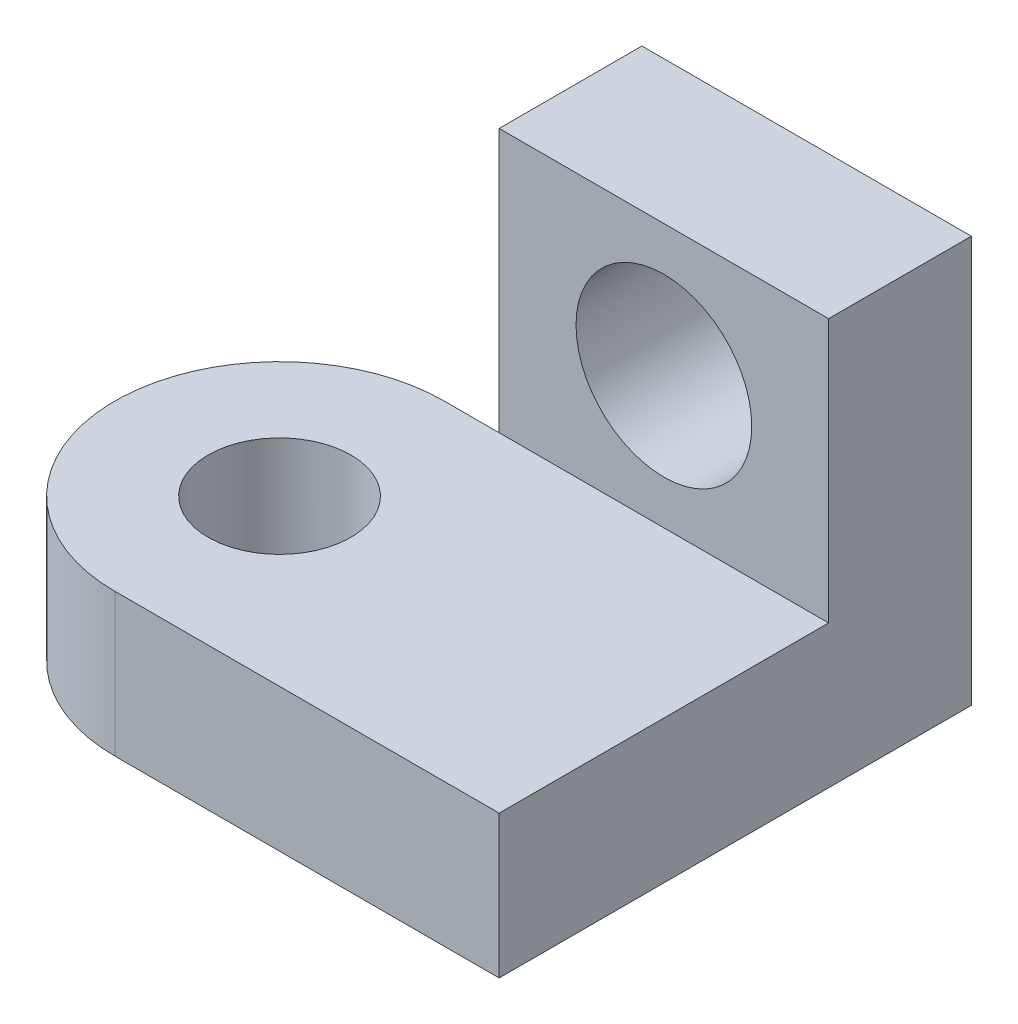
ISO-10303-21;
HEADER;
FILE_DESCRIPTION(('STEP AP214'),'2;1');
FILE_NAME('part.step','',(''),(''),'','','');
FILE_SCHEMA(('AUTOMOTIVE_DESIGN { 1 0 10303 214 1 1 1 1 }'));
ENDSEC;
DATA;
#1=APPLICATION_CONTEXT('core data for automotive mechanical design processes');
#2=APPLICATION_PROTOCOL_DEFINITION('international standard','automotive_design',2000,#1);
#3=PRODUCT_CONTEXT('',#1,'mechanical');
#4=PRODUCT('Part','Part','',(#3));
#5=PRODUCT_RELATED_PRODUCT_CATEGORY('part','',(#4));
#6=PRODUCT_DEFINITION_FORMATION('','',#4);
#7=PRODUCT_DEFINITION_CONTEXT('part definition',#1,'design');
#8=PRODUCT_DEFINITION('design','',#6,#7);
#9=PRODUCT_DEFINITION_SHAPE('','',#8);
#10=(LENGTH_UNIT() NAMED_UNIT(*) SI_UNIT(.MILLI.,.METRE.));
#11=(NAMED_UNIT(*) PLANE_ANGLE_UNIT() SI_UNIT($,.RADIAN.));
#12=(NAMED_UNIT(*) SI_UNIT($,.STERADIAN.) SOLID_ANGLE_UNIT());
#13=UNCERTAINTY_MEASURE_WITH_UNIT(LENGTH_MEASURE(1.E-05),#10,'distance_accuracy_value','');
#14=(GEOMETRIC_REPRESENTATION_CONTEXT(3) GLOBAL_UNCERTAINTY_ASSIGNED_CONTEXT((#13)) GLOBAL_UNIT_ASSIGNED_CONTEXT((#10,
#11,#12)) REPRESENTATION_CONTEXT('',''));
#15=CARTESIAN_POINT('',(0.,0.,0.));
#16=DIRECTION('',(0.,0.,1.));
#17=DIRECTION('',(1.,0.,0.));
#18=AXIS2_PLACEMENT_3D('',#15,#16,#17);
#19=CARTESIAN_POINT('',(0.,13.,43.));
#20=DIRECTION('',(0.,-1.,0.));
#21=DIRECTION('',(1.,0.,0.));
#22=AXIS2_PLACEMENT_3D('',#19,#20,#21);
#23=PLANE('',#22);
#24=CARTESIAN_POINT('',(-35.,13.,28.));
#25=DIRECTION('',(0.,1.,0.));
#26=DIRECTION('',(-1.,0.,0.));
#27=AXIS2_PLACEMENT_3D('',#24,#25,#26);
#28=CIRCLE('',#27,6.5);
#29=CARTESIAN_POINT('',(-41.5,13.,28.));
#30=VERTEX_POINT('',#29);
#31=EDGE_CURVE('E171',#30,#30,#28,.T.);
#32=ORIENTED_EDGE('',*,*,#31,.F.);
#33=EDGE_LOOP('',(#32));
#34=FACE_BOUND('',#33,.T.);
#35=CARTESIAN_POINT('',(-35.,13.,28.));
#36=DIRECTION('',(0.,1.,0.));
#37=DIRECTION('',(-1.,0.,0.));
#38=AXIS2_PLACEMENT_3D('',#35,#36,#37);
#39=CIRCLE('',#38,15.);
#40=CARTESIAN_POINT('',(-35.,13.,13.));
#41=VERTEX_POINT('',#40);
#42=CARTESIAN_POINT('',(-35.,13.,43.));
#43=VERTEX_POINT('',#42);
#44=EDGE_CURVE('E50',#41,#43,#39,.T.);
#45=ORIENTED_EDGE('',*,*,#44,.T.);
#46=DIRECTION('',(-1.,0.,0.));
#47=VECTOR('',#46,1.);
#48=CARTESIAN_POINT('',(0.,13.,43.));
#49=LINE('',#48,#47);
#50=CARTESIAN_POINT('',(0.,13.,43.));
#51=VERTEX_POINT('',#50);
#52=EDGE_CURVE('E100',#51,#43,#49,.T.);
#53=ORIENTED_EDGE('',*,*,#52,.F.);
#54=DIRECTION('',(0.,0.,-1.));
#55=VECTOR('',#54,1.);
#56=CARTESIAN_POINT('',(0.,13.,43.));
#57=LINE('',#56,#55);
#58=CARTESIAN_POINT('',(0.,13.,13.));
#59=VERTEX_POINT('',#58);
#60=EDGE_CURVE('E124',#51,#59,#57,.T.);
#61=ORIENTED_EDGE('',*,*,#60,.T.);
#62=DIRECTION('',(1.,0.,0.));
#63=VECTOR('',#62,1.);
#64=CARTESIAN_POINT('',(0.,13.,13.));
#65=LINE('',#64,#63);
#66=CARTESIAN_POINT('',(-30.,13.,13.));
#67=VERTEX_POINT('',#66);
#68=EDGE_CURVE('E134',#67,#59,#65,.T.);
#69=ORIENTED_EDGE('',*,*,#68,.F.);
#70=DIRECTION('',(1.,0.,0.));
#71=VECTOR('',#70,1.);
#72=CARTESIAN_POINT('',(-50.,13.,13.));
#73=LINE('',#72,#71);
#74=EDGE_CURVE('E103',#41,#67,#73,.T.);
#75=ORIENTED_EDGE('',*,*,#74,.F.);
#76=EDGE_LOOP('',(#45,#53,#61,#69,#75));
#77=FACE_BOUND('',#76,.T.);
#78=ADVANCED_FACE('F35',(#34,#77),#23,.F.);
#79=CARTESIAN_POINT('',(0.,0.,43.));
#80=DIRECTION('',(0.,-1.,0.));
#81=DIRECTION('',(1.,0.,0.));
#82=AXIS2_PLACEMENT_3D('',#79,#80,#81);
#83=PLANE('',#82);
#84=CARTESIAN_POINT('',(-35.,0.,28.));
#85=DIRECTION('',(0.,-1.,0.));
#86=DIRECTION('',(1.,0.,0.));
#87=AXIS2_PLACEMENT_3D('',#84,#85,#86);
#88=CIRCLE('',#87,6.5);
#89=CARTESIAN_POINT('',(-28.5,0.,28.));
#90=VERTEX_POINT('',#89);
#91=EDGE_CURVE('E39',#90,#90,#88,.T.);
#92=ORIENTED_EDGE('',*,*,#91,.F.);
#93=EDGE_LOOP('',(#92));
#94=FACE_BOUND('',#93,.T.);
#95=DIRECTION('',(-1.,0.,0.));
#96=VECTOR('',#95,1.);
#97=CARTESIAN_POINT('',(0.,0.,43.));
#98=LINE('',#97,#96);
#99=CARTESIAN_POINT('',(0.,0.,43.));
#100=VERTEX_POINT('',#99);
#101=CARTESIAN_POINT('',(-35.,0.,43.));
#102=VERTEX_POINT('',#101);
#103=EDGE_CURVE('E115',#100,#102,#98,.T.);
#104=ORIENTED_EDGE('',*,*,#103,.T.);
#105=CARTESIAN_POINT('',(-35.,0.,28.));
#106=DIRECTION('',(0.,-1.,0.));
#107=DIRECTION('',(1.,0.,0.));
#108=AXIS2_PLACEMENT_3D('',#105,#106,#107);
#109=CIRCLE('',#108,15.);
#110=CARTESIAN_POINT('',(-35.,0.,13.));
#111=VERTEX_POINT('',#110);
#112=EDGE_CURVE('E104',#102,#111,#109,.T.);
#113=ORIENTED_EDGE('',*,*,#112,.T.);
#114=DIRECTION('',(-1.,0.,0.));
#115=VECTOR('',#114,1.);
#116=CARTESIAN_POINT('',(0.,0.,13.));
#117=LINE('',#116,#115);
#118=CARTESIAN_POINT('',(-30.,0.,13.));
#119=VERTEX_POINT('',#118);
#120=EDGE_CURVE('E160',#119,#111,#117,.T.);
#121=ORIENTED_EDGE('',*,*,#120,.F.);
#122=DIRECTION('',(0.,0.,1.));
#123=VECTOR('',#122,1.);
#124=CARTESIAN_POINT('',(-30.,0.,43.));
#125=LINE('',#124,#123);
#126=CARTESIAN_POINT('',(-30.,0.,0.));
#127=VERTEX_POINT('',#126);
#128=EDGE_CURVE('E162',#127,#119,#125,.T.);
#129=ORIENTED_EDGE('',*,*,#128,.F.);
#130=DIRECTION('',(-1.,0.,0.));
#131=VECTOR('',#130,1.);
#132=CARTESIAN_POINT('',(0.,0.,0.));
#133=LINE('',#132,#131);
#134=CARTESIAN_POINT('',(0.,0.,0.));
#135=VERTEX_POINT('',#134);
#136=EDGE_CURVE('E116',#135,#127,#133,.T.);
#137=ORIENTED_EDGE('',*,*,#136,.F.);
#138=DIRECTION('',(0.,0.,-1.));
#139=VECTOR('',#138,1.);
#140=CARTESIAN_POINT('',(0.,0.,43.));
#141=LINE('',#140,#139);
#142=EDGE_CURVE('E127',#100,#135,#141,.T.);
#143=ORIENTED_EDGE('',*,*,#142,.F.);
#144=EDGE_LOOP('',(#104,#113,#121,#129,#137,#143));
#145=FACE_BOUND('',#144,.T.);
#146=ADVANCED_FACE('F167',(#94,#145),#83,.T.);
#147=CARTESIAN_POINT('',(0.,0.,13.));
#148=DIRECTION('',(-1.,0.,0.));
#149=DIRECTION('',(0.,-1.,0.));
#150=AXIS2_PLACEMENT_3D('',#147,#148,#149);
#151=PLANE('',#150);
#152=DIRECTION('',(0.,1.,0.));
#153=VECTOR('',#152,1.);
#154=CARTESIAN_POINT('',(0.,0.,0.));
#155=LINE('',#154,#153);
#156=CARTESIAN_POINT('',(0.,37.,0.));
#157=VERTEX_POINT('',#156);
#158=EDGE_CURVE('E149',#135,#157,#155,.T.);
#159=ORIENTED_EDGE('',*,*,#158,.T.);
#160=DIRECTION('',(0.,0.,-1.));
#161=VECTOR('',#160,1.);
#162=CARTESIAN_POINT('',(0.,37.,13.));
#163=LINE('',#162,#161);
#164=CARTESIAN_POINT('',(0.,37.,13.));
#165=VERTEX_POINT('',#164);
#166=EDGE_CURVE('E158',#165,#157,#163,.T.);
#167=ORIENTED_EDGE('',*,*,#166,.F.);
#168=DIRECTION('',(0.,1.,0.));
#169=VECTOR('',#168,1.);
#170=CARTESIAN_POINT('',(0.,0.,13.));
#171=LINE('',#170,#169);
#172=EDGE_CURVE('E138',#59,#165,#171,.T.);
#173=ORIENTED_EDGE('',*,*,#172,.F.);
#174=ORIENTED_EDGE('',*,*,#60,.F.);
#175=DIRECTION('',(0.,-1.,0.));
#176=VECTOR('',#175,1.);
#177=CARTESIAN_POINT('',(0.,0.,43.));
#178=LINE('',#177,#176);
#179=EDGE_CURVE('E114',#51,#100,#178,.T.);
#180=ORIENTED_EDGE('',*,*,#179,.T.);
#181=ORIENTED_EDGE('',*,*,#142,.T.);
#182=EDGE_LOOP('',(#159,#167,#173,#174,#180,#181));
#183=FACE_BOUND('',#182,.T.);
#184=ADVANCED_FACE('F181',(#183),#151,.F.);
#185=CARTESIAN_POINT('',(0.,37.,13.));
#186=DIRECTION('',(0.,1.,0.));
#187=DIRECTION('',(0.,0.,1.));
#188=AXIS2_PLACEMENT_3D('',#185,#186,#187);
#189=PLANE('',#188);
#190=DIRECTION('',(1.,0.,0.));
#191=VECTOR('',#190,1.);
#192=CARTESIAN_POINT('',(0.,37.,0.));
#193=LINE('',#192,#191);
#194=CARTESIAN_POINT('',(-30.,37.,0.));
#195=VERTEX_POINT('',#194);
#196=EDGE_CURVE('E152',#195,#157,#193,.T.);
#197=ORIENTED_EDGE('',*,*,#196,.F.);
#198=DIRECTION('',(0.,0.,-1.));
#199=VECTOR('',#198,1.);
#200=CARTESIAN_POINT('',(-30.,37.,13.));
#201=LINE('',#200,#199);
#202=CARTESIAN_POINT('',(-30.,37.,13.));
#203=VERTEX_POINT('',#202);
#204=EDGE_CURVE('E146',#203,#195,#201,.T.);
#205=ORIENTED_EDGE('',*,*,#204,.F.);
#206=DIRECTION('',(1.,0.,0.));
#207=VECTOR('',#206,1.);
#208=CARTESIAN_POINT('',(0.,37.,13.));
#209=LINE('',#208,#207);
#210=EDGE_CURVE('E140',#203,#165,#209,.T.);
#211=ORIENTED_EDGE('',*,*,#210,.T.);
#212=ORIENTED_EDGE('',*,*,#166,.T.);
#213=EDGE_LOOP('',(#197,#205,#211,#212));
#214=FACE_BOUND('',#213,.T.);
#215=ADVANCED_FACE('F187',(#214),#189,.T.);
#216=CARTESIAN_POINT('',(-15.,25.,13.));
#217=DIRECTION('',(0.,0.,-1.));
#218=DIRECTION('',(-1.,0.,0.));
#219=AXIS2_PLACEMENT_3D('',#216,#217,#218);
#220=CYLINDRICAL_SURFACE('',#219,8.);
#221=CARTESIAN_POINT('',(-15.,25.,13.));
#222=DIRECTION('',(0.,0.,1.));
#223=DIRECTION('',(1.,0.,0.));
#224=AXIS2_PLACEMENT_3D('',#221,#222,#223);
#225=CIRCLE('',#224,8.);
#226=CARTESIAN_POINT('',(-23.,25.,13.));
#227=VERTEX_POINT('',#226);
#228=EDGE_CURVE('E131',#227,#227,#225,.T.);
#229=CARTESIAN_POINT('',(-15.,25.,0.));
#230=DIRECTION('',(0.,0.,1.));
#231=DIRECTION('',(1.,0.,0.));
#232=AXIS2_PLACEMENT_3D('',#229,#230,#231);
#233=CIRCLE('',#232,8.);
#234=CARTESIAN_POINT('',(-23.,25.,0.));
#235=VERTEX_POINT('',#234);
#236=EDGE_CURVE('E130',#235,#235,#233,.T.);
#237=CARTESIAN_POINT('',(-23.,25.,13.));
#238=CARTESIAN_POINT('',(-23.,25.,12.8645833333333));
#239=CARTESIAN_POINT('',(-23.,25.,12.7291666666667));
#240=CARTESIAN_POINT('',(-23.,25.,12.4583333333333));
#241=CARTESIAN_POINT('',(-23.,25.,12.3229166666667));
#242=CARTESIAN_POINT('',(-23.,25.,12.0520833333333));
#243=CARTESIAN_POINT('',(-23.,25.,11.9166666666667));
#244=CARTESIAN_POINT('',(-23.,25.,11.6458333333333));
#245=CARTESIAN_POINT('',(-23.,25.,11.5104166666667));
#246=CARTESIAN_POINT('',(-23.,25.,11.2395833333333));
#247=CARTESIAN_POINT('',(-23.,25.,11.1041666666667));
#248=CARTESIAN_POINT('',(-23.,25.,10.8333333333333));
#249=CARTESIAN_POINT('',(-23.,25.,10.6979166666667));
#250=CARTESIAN_POINT('',(-23.,25.,10.4270833333333));
#251=CARTESIAN_POINT('',(-23.,25.,10.2916666666667));
#252=CARTESIAN_POINT('',(-23.,25.,10.0208333333333));
#253=CARTESIAN_POINT('',(-23.,25.,9.88541666666667));
#254=CARTESIAN_POINT('',(-23.,25.,9.61458333333333));
#255=CARTESIAN_POINT('',(-23.,25.,9.47916666666667));
#256=CARTESIAN_POINT('',(-23.,25.,9.20833333333333));
#257=CARTESIAN_POINT('',(-23.,25.,9.07291666666666));
#258=CARTESIAN_POINT('',(-23.,25.,8.80208333333333));
#259=CARTESIAN_POINT('',(-23.,25.,8.66666666666667));
#260=CARTESIAN_POINT('',(-23.,25.,8.39583333333333));
#261=CARTESIAN_POINT('',(-23.,25.,8.26041666666667));
#262=CARTESIAN_POINT('',(-23.,25.,7.98958333333333));
#263=CARTESIAN_POINT('',(-23.,25.,7.85416666666667));
#264=CARTESIAN_POINT('',(-23.,25.,7.58333333333333));
#265=CARTESIAN_POINT('',(-23.,25.,7.44791666666667));
#266=CARTESIAN_POINT('',(-23.,25.,7.17708333333333));
#267=CARTESIAN_POINT('',(-23.,25.,7.04166666666667));
#268=CARTESIAN_POINT('',(-23.,25.,6.77083333333333));
#269=CARTESIAN_POINT('',(-23.,25.,6.63541666666667));
#270=CARTESIAN_POINT('',(-23.,25.,6.36458333333333));
#271=CARTESIAN_POINT('',(-23.,25.,6.22916666666667));
#272=CARTESIAN_POINT('',(-23.,25.,5.95833333333333));
#273=CARTESIAN_POINT('',(-23.,25.,5.82291666666667));
#274=CARTESIAN_POINT('',(-23.,25.,5.55208333333333));
#275=CARTESIAN_POINT('',(-23.,25.,5.41666666666667));
#276=CARTESIAN_POINT('',(-23.,25.,5.14583333333333));
#277=CARTESIAN_POINT('',(-23.,25.,5.01041666666667));
#278=CARTESIAN_POINT('',(-23.,25.,4.73958333333333));
#279=CARTESIAN_POINT('',(-23.,25.,4.60416666666667));
#280=CARTESIAN_POINT('',(-23.,25.,4.33333333333333));
#281=CARTESIAN_POINT('',(-23.,25.,4.19791666666667));
#282=CARTESIAN_POINT('',(-23.,25.,3.92708333333333));
#283=CARTESIAN_POINT('',(-23.,25.,3.79166666666667));
#284=CARTESIAN_POINT('',(-23.,25.,3.52083333333333));
#285=CARTESIAN_POINT('',(-23.,25.,3.38541666666667));
#286=CARTESIAN_POINT('',(-23.,25.,3.11458333333333));
#287=CARTESIAN_POINT('',(-23.,25.,2.97916666666667));
#288=CARTESIAN_POINT('',(-23.,25.,2.70833333333333));
#289=CARTESIAN_POINT('',(-23.,25.,2.57291666666667));
#290=CARTESIAN_POINT('',(-23.,25.,2.30208333333333));
#291=CARTESIAN_POINT('',(-23.,25.,2.16666666666667));
#292=CARTESIAN_POINT('',(-23.,25.,1.89583333333333));
#293=CARTESIAN_POINT('',(-23.,25.,1.76041666666667));
#294=CARTESIAN_POINT('',(-23.,25.,1.48958333333333));
#295=CARTESIAN_POINT('',(-23.,25.,1.35416666666667));
#296=CARTESIAN_POINT('',(-23.,25.,1.08333333333333));
#297=CARTESIAN_POINT('',(-23.,25.,0.947916666666667));
#298=CARTESIAN_POINT('',(-23.,25.,0.677083333333334));
#299=CARTESIAN_POINT('',(-23.,25.,0.541666666666667));
#300=CARTESIAN_POINT('',(-23.,25.,0.270833333333334));
#301=CARTESIAN_POINT('',(-23.,25.,0.135416666666667));
#302=CARTESIAN_POINT('',(-23.,25.,0.));
#303=B_SPLINE_CURVE_WITH_KNOTS('',3,(#237,#238,#239,#240,#241,#242,#243,#244,#245,#246,#247,
#248,#249,#250,#251,#252,#253,#254,#255,#256,#257,#258,#259,#260,#261,#262,#263,#264,#265,#266,
#267,#268,#269,#270,#271,#272,#273,#274,#275,#276,#277,#278,#279,#280,#281,#282,#283,#284,#285,
#286,#287,#288,#289,#290,#291,#292,#293,#294,#295,#296,#297,#298,#299,#300,#301,#302),
.UNSPECIFIED.,.F.,.F.,(4,2,2,2,2,2,2,2,2,2,2,2,2,2,2,2,2,2,2,2,2,2,2,2,2,2,2,2,2,2,2,2,4),(0.,
0.40625,0.812500000000001,1.21875,1.625,2.03125,2.4375,2.84375,3.25,3.65625,4.0625,4.46875,
4.875,5.28125,5.6875,6.09375,6.5,6.90625,7.3125,7.71875,8.125,8.53125,8.9375,9.34375,9.75,
10.15625,10.5625,10.96875,11.375,11.78125,12.1875,12.59375,13.),.UNSPECIFIED.);
#304=EDGE_CURVE('BSEAM37',#227,#235,#303,.T.);
#305=ORIENTED_EDGE('',*,*,#228,.T.);
#306=ORIENTED_EDGE('',*,*,#236,.F.);
#307=ORIENTED_EDGE('',*,*,#304,.T.);
#308=ORIENTED_EDGE('',*,*,#304,.F.);
#309=EDGE_LOOP('',(#305,#307,#306,#308));
#310=FACE_BOUND('',#309,.T.);
#311=ADVANCED_FACE('F37',(#310),#220,.F.);
#312=CARTESIAN_POINT('',(-30.,0.,13.));
#313=DIRECTION('',(-1.,0.,0.));
#314=DIRECTION('',(0.,0.,1.));
#315=AXIS2_PLACEMENT_3D('',#312,#313,#314);
#316=PLANE('',#315);
#317=DIRECTION('',(0.,1.,0.));
#318=VECTOR('',#317,1.);
#319=CARTESIAN_POINT('',(-30.,0.,0.));
#320=LINE('',#319,#318);
#321=EDGE_CURVE('E135',#127,#195,#320,.T.);
#322=ORIENTED_EDGE('',*,*,#321,.F.);
#323=ORIENTED_EDGE('',*,*,#128,.T.);
#324=DIRECTION('',(0.,1.,0.));
#325=VECTOR('',#324,1.);
#326=CARTESIAN_POINT('',(-30.,-30.,13.));
#327=LINE('',#326,#325);
#328=EDGE_CURVE('E58',#119,#67,#327,.T.);
#329=ORIENTED_EDGE('',*,*,#328,.T.);
#330=DIRECTION('',(0.,1.,0.));
#331=VECTOR('',#330,1.);
#332=CARTESIAN_POINT('',(-30.,0.,13.));
#333=LINE('',#332,#331);
#334=EDGE_CURVE('E143',#67,#203,#333,.T.);
#335=ORIENTED_EDGE('',*,*,#334,.T.);
#336=ORIENTED_EDGE('',*,*,#204,.T.);
#337=EDGE_LOOP('',(#322,#323,#329,#335,#336));
#338=FACE_BOUND('',#337,.T.);
#339=ADVANCED_FACE('F198',(#338),#316,.T.);
#340=CARTESIAN_POINT('',(0.,0.,13.));
#341=DIRECTION('',(0.,0.,1.));
#342=DIRECTION('',(1.,0.,0.));
#343=AXIS2_PLACEMENT_3D('',#340,#341,#342);
#344=PLANE('',#343);
#345=ORIENTED_EDGE('',*,*,#228,.F.);
#346=EDGE_LOOP('',(#345));
#347=FACE_BOUND('',#346,.T.);
#348=ORIENTED_EDGE('',*,*,#68,.T.);
#349=ORIENTED_EDGE('',*,*,#172,.T.);
#350=ORIENTED_EDGE('',*,*,#210,.F.);
#351=ORIENTED_EDGE('',*,*,#334,.F.);
#352=EDGE_LOOP('',(#348,#349,#350,#351));
#353=FACE_BOUND('',#352,.T.);
#354=ADVANCED_FACE('F194',(#347,#353),#344,.T.);
#355=CARTESIAN_POINT('',(0.,0.,0.));
#356=DIRECTION('',(0.,0.,1.));
#357=DIRECTION('',(1.,0.,0.));
#358=AXIS2_PLACEMENT_3D('',#355,#356,#357);
#359=PLANE('',#358);
#360=ORIENTED_EDGE('',*,*,#236,.T.);
#361=EDGE_LOOP('',(#360));
#362=FACE_BOUND('',#361,.T.);
#363=ORIENTED_EDGE('',*,*,#136,.T.);
#364=ORIENTED_EDGE('',*,*,#321,.T.);
#365=ORIENTED_EDGE('',*,*,#196,.T.);
#366=ORIENTED_EDGE('',*,*,#158,.F.);
#367=EDGE_LOOP('',(#363,#364,#365,#366));
#368=FACE_BOUND('',#367,.T.);
#369=ADVANCED_FACE('F197',(#362,#368),#359,.F.);
#370=CARTESIAN_POINT('',(0.,0.,43.));
#371=DIRECTION('',(0.,0.,1.));
#372=DIRECTION('',(1.,0.,0.));
#373=AXIS2_PLACEMENT_3D('',#370,#371,#372);
#374=PLANE('',#373);
#375=DIRECTION('',(0.,1.,0.));
#376=VECTOR('',#375,1.);
#377=CARTESIAN_POINT('',(-35.,-30.,43.));
#378=LINE('',#377,#376);
#379=EDGE_CURVE('E11',#102,#43,#378,.T.);
#380=ORIENTED_EDGE('',*,*,#379,.F.);
#381=ORIENTED_EDGE('',*,*,#103,.F.);
#382=ORIENTED_EDGE('',*,*,#179,.F.);
#383=ORIENTED_EDGE('',*,*,#52,.T.);
#384=EDGE_LOOP('',(#380,#381,#382,#383));
#385=FACE_BOUND('',#384,.T.);
#386=ADVANCED_FACE('F112',(#385),#374,.T.);
#387=CARTESIAN_POINT('',(-50.,-30.,13.));
#388=DIRECTION('',(0.,0.,1.));
#389=DIRECTION('',(1.,0.,0.));
#390=AXIS2_PLACEMENT_3D('',#387,#388,#389);
#391=PLANE('',#390);
#392=ORIENTED_EDGE('',*,*,#120,.T.);
#393=DIRECTION('',(0.,1.,0.));
#394=VECTOR('',#393,1.);
#395=CARTESIAN_POINT('',(-35.,-30.,13.));
#396=LINE('',#395,#394);
#397=EDGE_CURVE('E44',#111,#41,#396,.T.);
#398=ORIENTED_EDGE('',*,*,#397,.T.);
#399=ORIENTED_EDGE('',*,*,#74,.T.);
#400=ORIENTED_EDGE('',*,*,#328,.F.);
#401=EDGE_LOOP('',(#392,#398,#399,#400));
#402=FACE_BOUND('',#401,.T.);
#403=ADVANCED_FACE('F164',(#402),#391,.F.);
#404=CARTESIAN_POINT('',(-35.,-30.,28.));
#405=DIRECTION('',(0.,1.,0.));
#406=DIRECTION('',(-1.,0.,0.));
#407=AXIS2_PLACEMENT_3D('',#404,#405,#406);
#408=CYLINDRICAL_SURFACE('',#407,15.);
#409=ORIENTED_EDGE('',*,*,#112,.F.);
#410=ORIENTED_EDGE('',*,*,#379,.T.);
#411=ORIENTED_EDGE('',*,*,#44,.F.);
#412=ORIENTED_EDGE('',*,*,#397,.F.);
#413=EDGE_LOOP('',(#409,#410,#411,#412));
#414=FACE_BOUND('',#413,.T.);
#415=ADVANCED_FACE('F107',(#414),#408,.T.);
#416=CARTESIAN_POINT('',(-35.,-30.,28.));
#417=DIRECTION('',(0.,1.,0.));
#418=DIRECTION('',(-1.,0.,0.));
#419=AXIS2_PLACEMENT_3D('',#416,#417,#418);
#420=CYLINDRICAL_SURFACE('',#419,6.5);
#421=ORIENTED_EDGE('',*,*,#91,.T.);
#422=EDGE_LOOP('',(#421));
#423=FACE_BOUND('',#422,.T.);
#424=ORIENTED_EDGE('',*,*,#31,.T.);
#425=EDGE_LOOP('',(#424));
#426=FACE_BOUND('',#425,.T.);
#427=ADVANCED_FACE('F178',(#423,#426),#420,.F.);
#428=CLOSED_SHELL('',(#78,#146,#184,#215,#311,#339,#354,#369,#386,#403,#415,#427));
#429=MANIFOLD_SOLID_BREP('B2',#428);
#430=ADVANCED_BREP_SHAPE_REPRESENTATION('',(#18,#429),#14);
#431=SHAPE_DEFINITION_REPRESENTATION(#9,#430);
ENDSEC;
END-ISO-10303-21;
